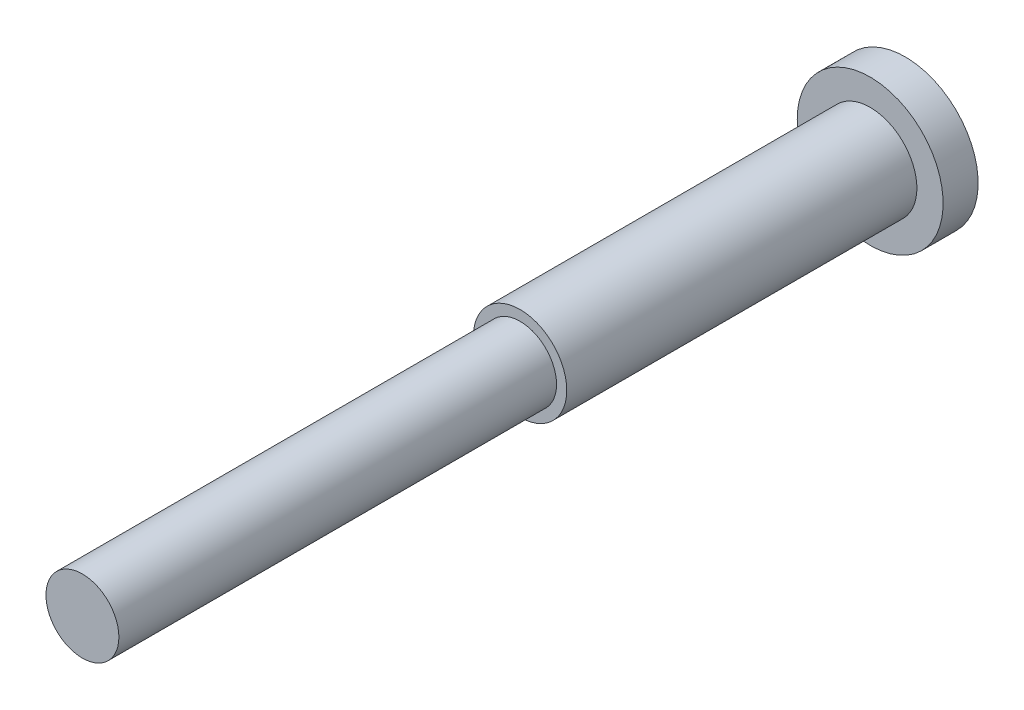
ISO-10303-21;
HEADER;
FILE_DESCRIPTION(('STEP AP214'),'2;1');
FILE_NAME('part.step','',(''),(''),'','','');
FILE_SCHEMA(('AUTOMOTIVE_DESIGN { 1 0 10303 214 1 1 1 1 }'));
ENDSEC;
DATA;
#1=APPLICATION_CONTEXT('core data for automotive mechanical design processes');
#2=APPLICATION_PROTOCOL_DEFINITION('international standard','automotive_design',2000,#1);
#3=PRODUCT_CONTEXT('',#1,'mechanical');
#4=PRODUCT('Part','Part','',(#3));
#5=PRODUCT_RELATED_PRODUCT_CATEGORY('part','',(#4));
#6=PRODUCT_DEFINITION_FORMATION('','',#4);
#7=PRODUCT_DEFINITION_CONTEXT('part definition',#1,'design');
#8=PRODUCT_DEFINITION('design','',#6,#7);
#9=PRODUCT_DEFINITION_SHAPE('','',#8);
#10=(LENGTH_UNIT() NAMED_UNIT(*) SI_UNIT(.MILLI.,.METRE.));
#11=(NAMED_UNIT(*) PLANE_ANGLE_UNIT() SI_UNIT($,.RADIAN.));
#12=(NAMED_UNIT(*) SI_UNIT($,.STERADIAN.) SOLID_ANGLE_UNIT());
#13=UNCERTAINTY_MEASURE_WITH_UNIT(LENGTH_MEASURE(1.E-05),#10,'distance_accuracy_value','');
#14=(GEOMETRIC_REPRESENTATION_CONTEXT(3) GLOBAL_UNCERTAINTY_ASSIGNED_CONTEXT((#13)) GLOBAL_UNIT_ASSIGNED_CONTEXT((#10,
#11,#12)) REPRESENTATION_CONTEXT('',''));
#15=CARTESIAN_POINT('',(0.,0.,0.));
#16=DIRECTION('',(0.,0.,1.));
#17=DIRECTION('',(1.,0.,0.));
#18=AXIS2_PLACEMENT_3D('',#15,#16,#17);
#19=CARTESIAN_POINT('',(0.,0.,60.));
#20=DIRECTION('',(0.,0.,1.));
#21=DIRECTION('',(1.,0.,0.));
#22=AXIS2_PLACEMENT_3D('',#19,#20,#21);
#23=PLANE('',#22);
#24=CARTESIAN_POINT('',(0.,0.,60.));
#25=DIRECTION('',(0.,0.,1.));
#26=DIRECTION('',(1.,0.,0.));
#27=AXIS2_PLACEMENT_3D('',#24,#25,#26);
#28=CIRCLE('',#27,8.);
#29=CARTESIAN_POINT('',(8.,0.,60.));
#30=VERTEX_POINT('',#29);
#31=EDGE_CURVE('E10',#30,#30,#28,.T.);
#32=ORIENTED_EDGE('',*,*,#31,.T.);
#33=EDGE_LOOP('',(#32));
#34=FACE_BOUND('',#33,.T.);
#35=CARTESIAN_POINT('',(0.,0.,60.));
#36=DIRECTION('',(0.,0.,1.));
#37=DIRECTION('',(1.,0.,0.));
#38=AXIS2_PLACEMENT_3D('',#35,#36,#37);
#39=CIRCLE('',#38,6.25);
#40=CARTESIAN_POINT('',(6.25,0.,60.));
#41=VERTEX_POINT('',#40);
#42=EDGE_CURVE('E43',#41,#41,#39,.T.);
#43=ORIENTED_EDGE('',*,*,#42,.F.);
#44=EDGE_LOOP('',(#43));
#45=FACE_BOUND('',#44,.T.);
#46=ADVANCED_FACE('F32',(#34,#45),#23,.T.);
#47=CARTESIAN_POINT('',(0.,0.,60.));
#48=DIRECTION('',(0.,0.,-1.));
#49=DIRECTION('',(-1.,0.,0.));
#50=AXIS2_PLACEMENT_3D('',#47,#48,#49);
#51=CYLINDRICAL_SURFACE('',#50,8.);
#52=ORIENTED_EDGE('',*,*,#31,.F.);
#53=EDGE_LOOP('',(#52));
#54=FACE_BOUND('',#53,.T.);
#55=CARTESIAN_POINT('',(0.,0.,0.));
#56=DIRECTION('',(0.,0.,-1.));
#57=DIRECTION('',(-1.,0.,0.));
#58=AXIS2_PLACEMENT_3D('',#55,#56,#57);
#59=CIRCLE('',#58,8.);
#60=CARTESIAN_POINT('',(-8.,0.,0.));
#61=VERTEX_POINT('',#60);
#62=EDGE_CURVE('E48',#61,#61,#59,.T.);
#63=ORIENTED_EDGE('',*,*,#62,.F.);
#64=EDGE_LOOP('',(#63));
#65=FACE_BOUND('',#64,.T.);
#66=ADVANCED_FACE('F34',(#54,#65),#51,.T.);
#67=CARTESIAN_POINT('',(0.,0.,135.));
#68=DIRECTION('',(0.,0.,-1.));
#69=DIRECTION('',(-1.,0.,0.));
#70=AXIS2_PLACEMENT_3D('',#67,#68,#69);
#71=CYLINDRICAL_SURFACE('',#70,6.25);
#72=CARTESIAN_POINT('',(0.,0.,135.));
#73=DIRECTION('',(0.,0.,1.));
#74=DIRECTION('',(1.,0.,0.));
#75=AXIS2_PLACEMENT_3D('',#72,#73,#74);
#76=CIRCLE('',#75,6.25);
#77=CARTESIAN_POINT('',(6.25,0.,135.));
#78=VERTEX_POINT('',#77);
#79=EDGE_CURVE('E39',#78,#78,#76,.T.);
#80=ORIENTED_EDGE('',*,*,#79,.F.);
#81=EDGE_LOOP('',(#80));
#82=FACE_BOUND('',#81,.T.);
#83=ORIENTED_EDGE('',*,*,#42,.T.);
#84=EDGE_LOOP('',(#83));
#85=FACE_BOUND('',#84,.T.);
#86=ADVANCED_FACE('F75',(#82,#85),#71,.T.);
#87=CARTESIAN_POINT('',(0.,0.,135.));
#88=DIRECTION('',(0.,0.,1.));
#89=DIRECTION('',(1.,0.,0.));
#90=AXIS2_PLACEMENT_3D('',#87,#88,#89);
#91=PLANE('',#90);
#92=ORIENTED_EDGE('',*,*,#79,.T.);
#93=EDGE_LOOP('',(#92));
#94=FACE_BOUND('',#93,.T.);
#95=ADVANCED_FACE('F70',(#94),#91,.T.);
#96=CARTESIAN_POINT('',(0.,0.,0.));
#97=DIRECTION('',(0.,0.,-1.));
#98=DIRECTION('',(-1.,0.,0.));
#99=AXIS2_PLACEMENT_3D('',#96,#97,#98);
#100=PLANE('',#99);
#101=CARTESIAN_POINT('',(0.,0.,0.));
#102=DIRECTION('',(0.,0.,-1.));
#103=DIRECTION('',(-1.,0.,0.));
#104=AXIS2_PLACEMENT_3D('',#101,#102,#103);
#105=CIRCLE('',#104,12.5);
#106=CARTESIAN_POINT('',(-12.5,0.,0.));
#107=VERTEX_POINT('',#106);
#108=EDGE_CURVE('E53',#107,#107,#105,.T.);
#109=ORIENTED_EDGE('',*,*,#108,.F.);
#110=EDGE_LOOP('',(#109));
#111=FACE_BOUND('',#110,.T.);
#112=ORIENTED_EDGE('',*,*,#62,.T.);
#113=EDGE_LOOP('',(#112));
#114=FACE_BOUND('',#113,.T.);
#115=ADVANCED_FACE('F64',(#111,#114),#100,.F.);
#116=CARTESIAN_POINT('',(0.,0.,-6.));
#117=DIRECTION('',(0.,0.,1.));
#118=DIRECTION('',(1.,0.,0.));
#119=AXIS2_PLACEMENT_3D('',#116,#117,#118);
#120=CYLINDRICAL_SURFACE('',#119,12.5);
#121=CARTESIAN_POINT('',(0.,0.,-6.));
#122=DIRECTION('',(0.,0.,-1.));
#123=DIRECTION('',(-1.,0.,0.));
#124=AXIS2_PLACEMENT_3D('',#121,#122,#123);
#125=CIRCLE('',#124,12.5);
#126=CARTESIAN_POINT('',(-12.5,0.,-6.));
#127=VERTEX_POINT('',#126);
#128=EDGE_CURVE('E52',#127,#127,#125,.T.);
#129=ORIENTED_EDGE('',*,*,#128,.F.);
#130=EDGE_LOOP('',(#129));
#131=FACE_BOUND('',#130,.T.);
#132=ORIENTED_EDGE('',*,*,#108,.T.);
#133=EDGE_LOOP('',(#132));
#134=FACE_BOUND('',#133,.T.);
#135=ADVANCED_FACE('F61',(#131,#134),#120,.T.);
#136=CARTESIAN_POINT('',(0.,0.,-6.));
#137=DIRECTION('',(0.,0.,-1.));
#138=DIRECTION('',(-1.,0.,0.));
#139=AXIS2_PLACEMENT_3D('',#136,#137,#138);
#140=PLANE('',#139);
#141=ORIENTED_EDGE('',*,*,#128,.T.);
#142=EDGE_LOOP('',(#141));
#143=FACE_BOUND('',#142,.T.);
#144=ADVANCED_FACE('F59',(#143),#140,.T.);
#145=CLOSED_SHELL('',(#46,#66,#86,#95,#115,#135,#144));
#146=MANIFOLD_SOLID_BREP('B2',#145);
#147=ADVANCED_BREP_SHAPE_REPRESENTATION('',(#18,#146),#14);
#148=SHAPE_DEFINITION_REPRESENTATION(#9,#147);
ENDSEC;
END-ISO-10303-21;
